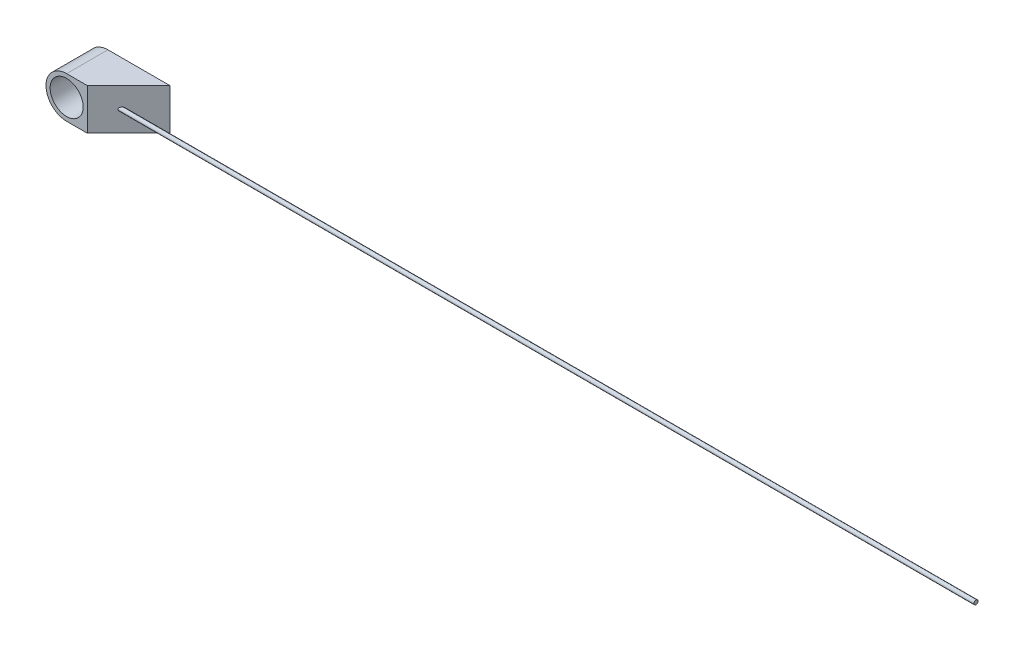
ISO-10303-21;
HEADER;
FILE_DESCRIPTION(('STEP AP214'),'2;1');
FILE_NAME('part.step','',(''),(''),'','','');
FILE_SCHEMA(('AUTOMOTIVE_DESIGN { 1 0 10303 214 1 1 1 1 }'));
ENDSEC;
DATA;
#1=APPLICATION_CONTEXT('core data for automotive mechanical design processes');
#2=APPLICATION_PROTOCOL_DEFINITION('international standard','automotive_design',2000,#1);
#3=PRODUCT_CONTEXT('',#1,'mechanical');
#4=PRODUCT('Part','Part','',(#3));
#5=PRODUCT_RELATED_PRODUCT_CATEGORY('part','',(#4));
#6=PRODUCT_DEFINITION_FORMATION('','',#4);
#7=PRODUCT_DEFINITION_CONTEXT('part definition',#1,'design');
#8=PRODUCT_DEFINITION('design','',#6,#7);
#9=PRODUCT_DEFINITION_SHAPE('','',#8);
#10=(LENGTH_UNIT() NAMED_UNIT(*) SI_UNIT(.MILLI.,.METRE.));
#11=(NAMED_UNIT(*) PLANE_ANGLE_UNIT() SI_UNIT($,.RADIAN.));
#12=(NAMED_UNIT(*) SI_UNIT($,.STERADIAN.) SOLID_ANGLE_UNIT());
#13=UNCERTAINTY_MEASURE_WITH_UNIT(LENGTH_MEASURE(1.E-05),#10,'distance_accuracy_value','');
#14=(GEOMETRIC_REPRESENTATION_CONTEXT(3) GLOBAL_UNCERTAINTY_ASSIGNED_CONTEXT((#13)) GLOBAL_UNIT_ASSIGNED_CONTEXT((#10,
#11,#12)) REPRESENTATION_CONTEXT('',''));
#15=CARTESIAN_POINT('',(0.,0.,0.));
#16=DIRECTION('',(0.,0.,1.));
#17=DIRECTION('',(1.,0.,0.));
#18=AXIS2_PLACEMENT_3D('',#15,#16,#17);
#19=CARTESIAN_POINT('',(0.,0.,10.));
#20=DIRECTION('',(0.,0.,-1.));
#21=DIRECTION('',(-1.,0.,0.));
#22=AXIS2_PLACEMENT_3D('',#19,#20,#21);
#23=CYLINDRICAL_SURFACE('',#22,5.);
#24=CARTESIAN_POINT('',(0.,0.,0.));
#25=DIRECTION('',(0.,0.,1.));
#26=DIRECTION('',(1.,0.,0.));
#27=AXIS2_PLACEMENT_3D('',#24,#25,#26);
#28=CIRCLE('',#27,5.);
#29=CARTESIAN_POINT('',(0.,5.,0.));
#30=VERTEX_POINT('',#29);
#31=CARTESIAN_POINT('',(0.,-5.,0.));
#32=VERTEX_POINT('',#31);
#33=EDGE_CURVE('E106',#30,#32,#28,.T.);
#34=ORIENTED_EDGE('',*,*,#33,.T.);
#35=DIRECTION('',(0.,0.,-1.));
#36=VECTOR('',#35,1.);
#37=CARTESIAN_POINT('',(0.,-5.,10.));
#38=LINE('',#37,#36);
#39=CARTESIAN_POINT('',(0.,-5.,10.));
#40=VERTEX_POINT('',#39);
#41=EDGE_CURVE('E92',#40,#32,#38,.T.);
#42=ORIENTED_EDGE('',*,*,#41,.F.);
#43=CARTESIAN_POINT('',(0.,0.,10.));
#44=DIRECTION('',(0.,0.,1.));
#45=DIRECTION('',(1.,0.,0.));
#46=AXIS2_PLACEMENT_3D('',#43,#44,#45);
#47=CIRCLE('',#46,5.);
#48=CARTESIAN_POINT('',(0.,5.,10.));
#49=VERTEX_POINT('',#48);
#50=EDGE_CURVE('E100',#49,#40,#47,.T.);
#51=ORIENTED_EDGE('',*,*,#50,.F.);
#52=DIRECTION('',(0.,0.,-1.));
#53=VECTOR('',#52,1.);
#54=CARTESIAN_POINT('',(0.,5.,10.));
#55=LINE('',#54,#53);
#56=EDGE_CURVE('E116',#49,#30,#55,.T.);
#57=ORIENTED_EDGE('',*,*,#56,.T.);
#58=EDGE_LOOP('',(#34,#42,#51,#57));
#59=FACE_BOUND('',#58,.T.);
#60=ADVANCED_FACE('F39',(#59),#23,.T.);
#61=CARTESIAN_POINT('',(0.,0.,10.));
#62=DIRECTION('',(0.,0.,1.));
#63=DIRECTION('',(1.,0.,0.));
#64=AXIS2_PLACEMENT_3D('',#61,#62,#63);
#65=PLANE('',#64);
#66=DIRECTION('',(1.,0.,0.));
#67=VECTOR('',#66,1.);
#68=CARTESIAN_POINT('',(5.,-5.,10.));
#69=LINE('',#68,#67);
#70=CARTESIAN_POINT('',(5.,-5.,10.));
#71=VERTEX_POINT('',#70);
#72=EDGE_CURVE('E94',#40,#71,#69,.T.);
#73=ORIENTED_EDGE('',*,*,#72,.T.);
#74=DIRECTION('',(0.,1.,0.));
#75=VECTOR('',#74,1.);
#76=CARTESIAN_POINT('',(5.,0.,10.));
#77=LINE('',#76,#75);
#78=CARTESIAN_POINT('',(5.,5.,10.));
#79=VERTEX_POINT('',#78);
#80=EDGE_CURVE('E96',#71,#79,#77,.T.);
#81=ORIENTED_EDGE('',*,*,#80,.T.);
#82=DIRECTION('',(-1.,0.,0.));
#83=VECTOR('',#82,1.);
#84=CARTESIAN_POINT('',(0.,5.,10.));
#85=LINE('',#84,#83);
#86=EDGE_CURVE('E123',#79,#49,#85,.T.);
#87=ORIENTED_EDGE('',*,*,#86,.T.);
#88=ORIENTED_EDGE('',*,*,#50,.T.);
#89=EDGE_LOOP('',(#73,#81,#87,#88));
#90=FACE_BOUND('',#89,.T.);
#91=CARTESIAN_POINT('',(0.,0.,10.));
#92=DIRECTION('',(0.,0.,1.));
#93=DIRECTION('',(1.,0.,0.));
#94=AXIS2_PLACEMENT_3D('',#91,#92,#93);
#95=CIRCLE('',#94,4.);
#96=CARTESIAN_POINT('',(4.,0.,10.));
#97=VERTEX_POINT('',#96);
#98=EDGE_CURVE('E110',#97,#97,#95,.T.);
#99=ORIENTED_EDGE('',*,*,#98,.F.);
#100=EDGE_LOOP('',(#99));
#101=FACE_BOUND('',#100,.T.);
#102=ADVANCED_FACE('F154',(#90,#101),#65,.T.);
#103=CARTESIAN_POINT('',(0.,0.,0.));
#104=DIRECTION('',(0.,0.,1.));
#105=DIRECTION('',(1.,0.,0.));
#106=AXIS2_PLACEMENT_3D('',#103,#104,#105);
#107=PLANE('',#106);
#108=DIRECTION('',(1.,0.,0.));
#109=VECTOR('',#108,1.);
#110=CARTESIAN_POINT('',(5.,-5.,0.));
#111=LINE('',#110,#109);
#112=CARTESIAN_POINT('',(15.,-5.,0.));
#113=VERTEX_POINT('',#112);
#114=EDGE_CURVE('E83',#32,#113,#111,.T.);
#115=ORIENTED_EDGE('',*,*,#114,.F.);
#116=ORIENTED_EDGE('',*,*,#33,.F.);
#117=DIRECTION('',(-1.,0.,0.));
#118=VECTOR('',#117,1.);
#119=CARTESIAN_POINT('',(0.,5.,0.));
#120=LINE('',#119,#118);
#121=CARTESIAN_POINT('',(15.,5.,0.));
#122=VERTEX_POINT('',#121);
#123=EDGE_CURVE('E86',#122,#30,#120,.T.);
#124=ORIENTED_EDGE('',*,*,#123,.F.);
#125=DIRECTION('',(0.,1.,0.));
#126=VECTOR('',#125,1.);
#127=CARTESIAN_POINT('',(15.,5.,0.));
#128=LINE('',#127,#126);
#129=EDGE_CURVE('E80',#113,#122,#128,.T.);
#130=ORIENTED_EDGE('',*,*,#129,.F.);
#131=EDGE_LOOP('',(#115,#116,#124,#130));
#132=FACE_BOUND('',#131,.T.);
#133=CARTESIAN_POINT('',(0.,0.,0.));
#134=DIRECTION('',(0.,0.,1.));
#135=DIRECTION('',(1.,0.,0.));
#136=AXIS2_PLACEMENT_3D('',#133,#134,#135);
#137=CIRCLE('',#136,4.);
#138=CARTESIAN_POINT('',(4.,0.,0.));
#139=VERTEX_POINT('',#138);
#140=EDGE_CURVE('E112',#139,#139,#137,.T.);
#141=ORIENTED_EDGE('',*,*,#140,.T.);
#142=EDGE_LOOP('',(#141));
#143=FACE_BOUND('',#142,.T.);
#144=ADVANCED_FACE('F81',(#132,#143),#107,.F.);
#145=CARTESIAN_POINT('',(0.,0.,10.));
#146=DIRECTION('',(0.,0.,-1.));
#147=DIRECTION('',(-1.,0.,0.));
#148=AXIS2_PLACEMENT_3D('',#145,#146,#147);
#149=CYLINDRICAL_SURFACE('',#148,4.);
#150=ORIENTED_EDGE('',*,*,#98,.T.);
#151=EDGE_LOOP('',(#150));
#152=FACE_BOUND('',#151,.T.);
#153=ORIENTED_EDGE('',*,*,#140,.F.);
#154=EDGE_LOOP('',(#153));
#155=FACE_BOUND('',#154,.T.);
#156=ADVANCED_FACE('F162',(#152,#155),#149,.F.);
#157=CARTESIAN_POINT('',(0.,5.,10.));
#158=DIRECTION('',(0.,-1.,0.));
#159=DIRECTION('',(0.,0.,-1.));
#160=AXIS2_PLACEMENT_3D('',#157,#158,#159);
#161=PLANE('',#160);
#162=ORIENTED_EDGE('',*,*,#86,.F.);
#163=DIRECTION('',(-0.707106781186546,0.,0.707106781186549));
#164=VECTOR('',#163,1.);
#165=CARTESIAN_POINT('',(5.,5.,10.));
#166=LINE('',#165,#164);
#167=EDGE_CURVE('E49',#79,#122,#166,.F.);
#168=ORIENTED_EDGE('',*,*,#167,.T.);
#169=ORIENTED_EDGE('',*,*,#123,.T.);
#170=ORIENTED_EDGE('',*,*,#56,.F.);
#171=EDGE_LOOP('',(#162,#168,#169,#170));
#172=FACE_BOUND('',#171,.T.);
#173=ADVANCED_FACE('F166',(#172),#161,.F.);
#174=CARTESIAN_POINT('',(5.,-5.,0.));
#175=DIRECTION('',(0.,-1.,0.));
#176=DIRECTION('',(0.,0.,-1.));
#177=AXIS2_PLACEMENT_3D('',#174,#175,#176);
#178=PLANE('',#177);
#179=ORIENTED_EDGE('',*,*,#114,.T.);
#180=DIRECTION('',(0.707106781186546,0.,-0.707106781186549));
#181=VECTOR('',#180,1.);
#182=CARTESIAN_POINT('',(10.,-5.,4.99999999999998));
#183=LINE('',#182,#181);
#184=EDGE_CURVE('E11',#113,#71,#183,.F.);
#185=ORIENTED_EDGE('',*,*,#184,.T.);
#186=ORIENTED_EDGE('',*,*,#72,.F.);
#187=ORIENTED_EDGE('',*,*,#41,.T.);
#188=EDGE_LOOP('',(#179,#185,#186,#187));
#189=FACE_BOUND('',#188,.T.);
#190=ADVANCED_FACE('F90',(#189),#178,.T.);
#191=CARTESIAN_POINT('',(5.,0.,10.));
#192=DIRECTION('',(-0.707106781186549,0.,-0.707106781186546));
#193=DIRECTION('',(0.,1.,0.));
#194=AXIS2_PLACEMENT_3D('',#191,#192,#193);
#195=PLANE('',#194);
#196=CARTESIAN_POINT('',(9.21463368287631,0.,5.78536631712367));
#197=DIRECTION('',(-0.707106781186549,0.,-0.707106781186546));
#198=DIRECTION('',(-0.707106781186546,0.,0.707106781186549));
#199=AXIS2_PLACEMENT_3D('',#196,#197,#198);
#200=ELLIPSE('',#199,0.707106781186547,0.500000000000001);
#201=CARTESIAN_POINT('',(8.71463368287631,0.,6.28536631712367));
#202=VERTEX_POINT('',#201);
#203=EDGE_CURVE('E43',#202,#202,#200,.T.);
#204=ORIENTED_EDGE('',*,*,#203,.T.);
#205=EDGE_LOOP('',(#204));
#206=FACE_BOUND('',#205,.T.);
#207=ORIENTED_EDGE('',*,*,#184,.F.);
#208=ORIENTED_EDGE('',*,*,#129,.T.);
#209=ORIENTED_EDGE('',*,*,#167,.F.);
#210=ORIENTED_EDGE('',*,*,#80,.F.);
#211=EDGE_LOOP('',(#207,#208,#209,#210));
#212=FACE_BOUND('',#211,.T.);
#213=ADVANCED_FACE('F41',(#206,#212),#195,.F.);
#214=CARTESIAN_POINT('',(216.,0.,5.78536631712367));
#215=DIRECTION('',(-1.,0.,0.));
#216=DIRECTION('',(0.,0.,1.));
#217=AXIS2_PLACEMENT_3D('',#214,#215,#216);
#218=CYLINDRICAL_SURFACE('',#217,0.500000000000001);
#219=ORIENTED_EDGE('',*,*,#203,.F.);
#220=EDGE_LOOP('',(#219));
#221=FACE_BOUND('',#220,.T.);
#222=CARTESIAN_POINT('',(216.,0.,5.78536631712367));
#223=DIRECTION('',(1.,0.,0.));
#224=DIRECTION('',(0.,0.,-1.));
#225=AXIS2_PLACEMENT_3D('',#222,#223,#224);
#226=CIRCLE('',#225,0.500000000000001);
#227=CARTESIAN_POINT('',(216.,0.,5.28536631712367));
#228=VERTEX_POINT('',#227);
#229=EDGE_CURVE('E132',#228,#228,#226,.T.);
#230=ORIENTED_EDGE('',*,*,#229,.F.);
#231=EDGE_LOOP('',(#230));
#232=FACE_BOUND('',#231,.T.);
#233=ADVANCED_FACE('F142',(#221,#232),#218,.T.);
#234=CARTESIAN_POINT('',(216.,0.,5.78536631712367));
#235=DIRECTION('',(1.,0.,0.));
#236=DIRECTION('',(0.,0.,-1.));
#237=AXIS2_PLACEMENT_3D('',#234,#235,#236);
#238=PLANE('',#237);
#239=ORIENTED_EDGE('',*,*,#229,.T.);
#240=EDGE_LOOP('',(#239));
#241=FACE_BOUND('',#240,.T.);
#242=ADVANCED_FACE('F145',(#241),#238,.T.);
#243=CLOSED_SHELL('',(#60,#102,#144,#156,#173,#190,#213,#233,#242));
#244=MANIFOLD_SOLID_BREP('B2',#243);
#245=ADVANCED_BREP_SHAPE_REPRESENTATION('',(#18,#244),#14);
#246=SHAPE_DEFINITION_REPRESENTATION(#9,#245);
ENDSEC;
END-ISO-10303-21;
